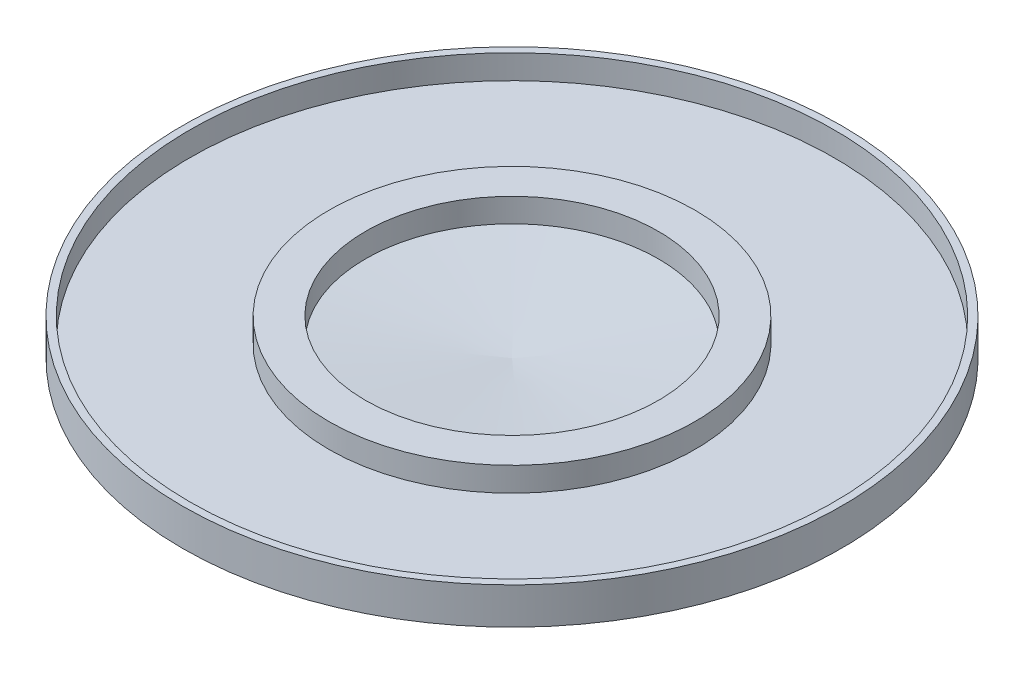
ISO-10303-21;
HEADER;
FILE_DESCRIPTION(('STEP AP214'),'2;1');
FILE_NAME('part.step','',(''),(''),'','','');
FILE_SCHEMA(('AUTOMOTIVE_DESIGN { 1 0 10303 214 1 1 1 1 }'));
ENDSEC;
DATA;
#1=APPLICATION_CONTEXT('core data for automotive mechanical design processes');
#2=APPLICATION_PROTOCOL_DEFINITION('international standard','automotive_design',2000,#1);
#3=PRODUCT_CONTEXT('',#1,'mechanical');
#4=PRODUCT('Part','Part','',(#3));
#5=PRODUCT_RELATED_PRODUCT_CATEGORY('part','',(#4));
#6=PRODUCT_DEFINITION_FORMATION('','',#4);
#7=PRODUCT_DEFINITION_CONTEXT('part definition',#1,'design');
#8=PRODUCT_DEFINITION('design','',#6,#7);
#9=PRODUCT_DEFINITION_SHAPE('','',#8);
#10=(LENGTH_UNIT() NAMED_UNIT(*) SI_UNIT(.MILLI.,.METRE.));
#11=(NAMED_UNIT(*) PLANE_ANGLE_UNIT() SI_UNIT($,.RADIAN.));
#12=(NAMED_UNIT(*) SI_UNIT($,.STERADIAN.) SOLID_ANGLE_UNIT());
#13=UNCERTAINTY_MEASURE_WITH_UNIT(LENGTH_MEASURE(1.E-05),#10,'distance_accuracy_value','');
#14=(GEOMETRIC_REPRESENTATION_CONTEXT(3) GLOBAL_UNCERTAINTY_ASSIGNED_CONTEXT((#13)) GLOBAL_UNIT_ASSIGNED_CONTEXT((#10,
#11,#12)) REPRESENTATION_CONTEXT('',''));
#15=CARTESIAN_POINT('',(0.,0.,0.));
#16=DIRECTION('',(0.,0.,1.));
#17=DIRECTION('',(1.,0.,0.));
#18=AXIS2_PLACEMENT_3D('',#15,#16,#17);
#19=CARTESIAN_POINT('',(0.,50.,0.));
#20=DIRECTION('',(0.,-1.,0.));
#21=DIRECTION('',(0.,0.,-1.));
#22=AXIS2_PLACEMENT_3D('',#19,#20,#21);
#23=CYLINDRICAL_SURFACE('',#22,200.02);
#24=CARTESIAN_POINT('',(0.,50.,0.));
#25=DIRECTION('',(0.,1.,0.));
#26=DIRECTION('',(0.,0.,1.));
#27=AXIS2_PLACEMENT_3D('',#24,#25,#26);
#28=CIRCLE('',#27,200.02);
#29=CARTESIAN_POINT('',(0.,50.,200.02));
#30=VERTEX_POINT('',#29);
#31=EDGE_CURVE('E58',#30,#30,#28,.T.);
#32=ORIENTED_EDGE('',*,*,#31,.T.);
#33=EDGE_LOOP('',(#32));
#34=FACE_BOUND('',#33,.T.);
#35=CARTESIAN_POINT('',(0.,0.,0.));
#36=DIRECTION('',(0.,1.,0.));
#37=DIRECTION('',(0.,0.,1.));
#38=AXIS2_PLACEMENT_3D('',#35,#36,#37);
#39=CIRCLE('',#38,200.02);
#40=CARTESIAN_POINT('',(0.,0.,200.02));
#41=VERTEX_POINT('',#40);
#42=EDGE_CURVE('E54',#41,#41,#39,.T.);
#43=ORIENTED_EDGE('',*,*,#42,.F.);
#44=EDGE_LOOP('',(#43));
#45=FACE_BOUND('',#44,.T.);
#46=ADVANCED_FACE('F51',(#34,#45),#23,.F.);
#47=CARTESIAN_POINT('',(0.,50.,0.));
#48=DIRECTION('',(0.,-1.,0.));
#49=DIRECTION('',(0.,0.,-1.));
#50=AXIS2_PLACEMENT_3D('',#47,#48,#49);
#51=CYLINDRICAL_SURFACE('',#50,250.);
#52=CARTESIAN_POINT('',(0.,17.,0.));
#53=DIRECTION('',(0.,1.,0.));
#54=DIRECTION('',(0.,0.,1.));
#55=AXIS2_PLACEMENT_3D('',#52,#53,#54);
#56=CIRCLE('',#55,250.);
#57=CARTESIAN_POINT('',(0.,17.,250.));
#58=VERTEX_POINT('',#57);
#59=EDGE_CURVE('E64',#58,#58,#56,.T.);
#60=ORIENTED_EDGE('',*,*,#59,.T.);
#61=EDGE_LOOP('',(#60));
#62=FACE_BOUND('',#61,.T.);
#63=CARTESIAN_POINT('',(0.,50.,0.));
#64=DIRECTION('',(0.,1.,0.));
#65=DIRECTION('',(0.,0.,1.));
#66=AXIS2_PLACEMENT_3D('',#63,#64,#65);
#67=CIRCLE('',#66,250.);
#68=CARTESIAN_POINT('',(0.,50.,250.));
#69=VERTEX_POINT('',#68);
#70=EDGE_CURVE('E12',#69,#69,#67,.T.);
#71=ORIENTED_EDGE('',*,*,#70,.F.);
#72=EDGE_LOOP('',(#71));
#73=FACE_BOUND('',#72,.T.);
#74=ADVANCED_FACE('F106',(#62,#73),#51,.T.);
#75=CARTESIAN_POINT('',(0.,50.,0.));
#76=DIRECTION('',(0.,1.,0.));
#77=DIRECTION('',(0.,0.,1.));
#78=AXIS2_PLACEMENT_3D('',#75,#76,#77);
#79=PLANE('',#78);
#80=ORIENTED_EDGE('',*,*,#31,.F.);
#81=EDGE_LOOP('',(#80));
#82=FACE_BOUND('',#81,.T.);
#83=ORIENTED_EDGE('',*,*,#70,.T.);
#84=EDGE_LOOP('',(#83));
#85=FACE_BOUND('',#84,.T.);
#86=ADVANCED_FACE('F97',(#82,#85),#79,.T.);
#87=CARTESIAN_POINT('',(0.,0.,0.));
#88=DIRECTION('',(0.,1.,0.));
#89=DIRECTION('',(0.,0.,1.));
#90=AXIS2_PLACEMENT_3D('',#87,#88,#89);
#91=PLANE('',#90);
#92=ORIENTED_EDGE('',*,*,#42,.T.);
#93=EDGE_LOOP('',(#92));
#94=FACE_BOUND('',#93,.T.);
#95=CARTESIAN_POINT('',(0.,0.,0.));
#96=DIRECTION('',(0.,1.,0.));
#97=DIRECTION('',(0.,0.,1.));
#98=AXIS2_PLACEMENT_3D('',#95,#96,#97);
#99=CIRCLE('',#98,450.);
#100=CARTESIAN_POINT('',(0.,0.,450.));
#101=VERTEX_POINT('',#100);
#102=EDGE_CURVE('E71',#101,#101,#99,.T.);
#103=ORIENTED_EDGE('',*,*,#102,.F.);
#104=EDGE_LOOP('',(#103));
#105=FACE_BOUND('',#104,.T.);
#106=ADVANCED_FACE('F94',(#94,#105),#91,.F.);
#107=CARTESIAN_POINT('',(0.,17.,0.));
#108=DIRECTION('',(0.,1.,0.));
#109=DIRECTION('',(0.,0.,1.));
#110=AXIS2_PLACEMENT_3D('',#107,#108,#109);
#111=PLANE('',#110);
#112=ORIENTED_EDGE('',*,*,#59,.F.);
#113=EDGE_LOOP('',(#112));
#114=FACE_BOUND('',#113,.T.);
#115=CARTESIAN_POINT('',(0.,17.,0.));
#116=DIRECTION('',(0.,1.,0.));
#117=DIRECTION('',(0.,0.,1.));
#118=AXIS2_PLACEMENT_3D('',#115,#116,#117);
#119=CIRCLE('',#118,440.);
#120=CARTESIAN_POINT('',(0.,17.,440.));
#121=VERTEX_POINT('',#120);
#122=EDGE_CURVE('E67',#121,#121,#119,.F.);
#123=ORIENTED_EDGE('',*,*,#122,.F.);
#124=EDGE_LOOP('',(#123));
#125=FACE_BOUND('',#124,.T.);
#126=ADVANCED_FACE('F96',(#114,#125),#111,.T.);
#127=CARTESIAN_POINT('',(0.,50.,0.));
#128=DIRECTION('',(0.,-1.,0.));
#129=DIRECTION('',(0.,0.,-1.));
#130=AXIS2_PLACEMENT_3D('',#127,#128,#129);
#131=CYLINDRICAL_SURFACE('',#130,440.);
#132=ORIENTED_EDGE('',*,*,#122,.T.);
#133=EDGE_LOOP('',(#132));
#134=FACE_BOUND('',#133,.T.);
#135=CARTESIAN_POINT('',(0.,50.,0.));
#136=DIRECTION('',(0.,1.,0.));
#137=DIRECTION('',(0.,0.,1.));
#138=AXIS2_PLACEMENT_3D('',#135,#136,#137);
#139=CIRCLE('',#138,440.);
#140=CARTESIAN_POINT('',(0.,50.,440.));
#141=VERTEX_POINT('',#140);
#142=EDGE_CURVE('E74',#141,#141,#139,.T.);
#143=ORIENTED_EDGE('',*,*,#142,.T.);
#144=EDGE_LOOP('',(#143));
#145=FACE_BOUND('',#144,.T.);
#146=ADVANCED_FACE('F80',(#134,#145),#131,.F.);
#147=CARTESIAN_POINT('',(0.,50.,0.));
#148=DIRECTION('',(0.,-1.,0.));
#149=DIRECTION('',(0.,0.,-1.));
#150=AXIS2_PLACEMENT_3D('',#147,#148,#149);
#151=CYLINDRICAL_SURFACE('',#150,450.);
#152=CARTESIAN_POINT('',(0.,50.,0.));
#153=DIRECTION('',(0.,1.,0.));
#154=DIRECTION('',(0.,0.,1.));
#155=AXIS2_PLACEMENT_3D('',#152,#153,#154);
#156=CIRCLE('',#155,450.);
#157=CARTESIAN_POINT('',(0.,50.,450.));
#158=VERTEX_POINT('',#157);
#159=EDGE_CURVE('E70',#158,#158,#156,.T.);
#160=ORIENTED_EDGE('',*,*,#159,.F.);
#161=EDGE_LOOP('',(#160));
#162=FACE_BOUND('',#161,.T.);
#163=ORIENTED_EDGE('',*,*,#102,.T.);
#164=EDGE_LOOP('',(#163));
#165=FACE_BOUND('',#164,.T.);
#166=ADVANCED_FACE('F85',(#162,#165),#151,.T.);
#167=CARTESIAN_POINT('',(0.,50.,0.));
#168=DIRECTION('',(0.,1.,0.));
#169=DIRECTION('',(0.,0.,1.));
#170=AXIS2_PLACEMENT_3D('',#167,#168,#169);
#171=PLANE('',#170);
#172=ORIENTED_EDGE('',*,*,#142,.F.);
#173=EDGE_LOOP('',(#172));
#174=FACE_BOUND('',#173,.T.);
#175=ORIENTED_EDGE('',*,*,#159,.T.);
#176=EDGE_LOOP('',(#175));
#177=FACE_BOUND('',#176,.T.);
#178=ADVANCED_FACE('F82',(#174,#177),#171,.T.);
#179=CLOSED_SHELL('',(#46,#74,#86,#106,#126,#146,#166,#178));
#180=MANIFOLD_SOLID_BREP('B2',#179);
#181=CARTESIAN_POINT('',(0.,0.,0.));
#182=DIRECTION('',(0.,-1.,0.));
#183=DIRECTION('',(0.,0.,-1.));
#184=AXIS2_PLACEMENT_3D('',#181,#182,#183);
#185=PLANE('',#184);
#186=CARTESIAN_POINT('',(-0.01,0.,0.));
#187=DIRECTION('',(0.,-1.,0.));
#188=DIRECTION('',(0.,0.,-1.));
#189=AXIS2_PLACEMENT_3D('',#186,#187,#188);
#190=CIRCLE('',#189,200.01);
#191=CARTESIAN_POINT('',(-0.01,0.,-200.01));
#192=VERTEX_POINT('',#191);
#193=EDGE_CURVE('E50',#192,#192,#190,.T.);
#194=ORIENTED_EDGE('',*,*,#193,.T.);
#195=EDGE_LOOP('',(#194));
#196=FACE_BOUND('',#195,.T.);
#197=CARTESIAN_POINT('',(-0.01,0.,0.));
#198=DIRECTION('',(0.,-1.,0.));
#199=DIRECTION('',(0.,0.,-1.));
#200=AXIS2_PLACEMENT_3D('',#197,#198,#199);
#201=CIRCLE('',#200,0.01);
#202=CARTESIAN_POINT('',(-0.01,0.,0.01000000000001));
#203=VERTEX_POINT('',#202);
#204=EDGE_CURVE('E189',#203,#203,#201,.T.);
#205=ORIENTED_EDGE('',*,*,#204,.F.);
#206=EDGE_LOOP('',(#205));
#207=FACE_BOUND('',#206,.T.);
#208=ADVANCED_FACE('F179',(#196,#207),#185,.T.);
#209=CARTESIAN_POINT('',(-0.01,0.,0.));
#210=DIRECTION('',(0.,-1.,0.));
#211=DIRECTION('',(0.,0.,-1.));
#212=AXIS2_PLACEMENT_3D('',#209,#210,#211);
#213=CYLINDRICAL_SURFACE('',#212,200.01);
#214=CARTESIAN_POINT('',(-0.01,17.499231759728,0.));
#215=DIRECTION('',(0.,-1.,0.));
#216=DIRECTION('',(0.,0.,-1.));
#217=AXIS2_PLACEMENT_3D('',#214,#215,#216);
#218=CIRCLE('',#217,200.01);
#219=CARTESIAN_POINT('',(-0.01,17.499231759728,200.01));
#220=VERTEX_POINT('',#219);
#221=EDGE_CURVE('E185',#220,#220,#218,.T.);
#222=ORIENTED_EDGE('',*,*,#221,.T.);
#223=EDGE_LOOP('',(#222));
#224=FACE_BOUND('',#223,.T.);
#225=ORIENTED_EDGE('',*,*,#193,.F.);
#226=EDGE_LOOP('',(#225));
#227=FACE_BOUND('',#226,.T.);
#228=ADVANCED_FACE('F200',(#224,#227),#213,.T.);
#229=CARTESIAN_POINT('',(-0.01,17.499231759728,0.));
#230=DIRECTION('',(0.,1.,0.));
#231=DIRECTION('',(0.,0.,1.));
#232=AXIS2_PLACEMENT_3D('',#229,#230,#231);
#233=CONICAL_SURFACE('',#232,200.01,1.48352242586232);
#234=CARTESIAN_POINT('',(-0.01,0.,0.01000000000001));
#235=CARTESIAN_POINT('',(-0.01,0.182283664163832,2.09333333333335));
#236=CARTESIAN_POINT('',(-0.01,0.364567328327666,4.17666666666668));
#237=CARTESIAN_POINT('',(-0.01,0.729134656655335,8.34333333333335));
#238=CARTESIAN_POINT('',(-0.01,0.91141832081917,10.4266666666667));
#239=CARTESIAN_POINT('',(-0.01,1.27598564914684,14.5933333333334));
#240=CARTESIAN_POINT('',(-0.01,1.45826931331067,16.6766666666667));
#241=CARTESIAN_POINT('',(-0.01,1.82283664163834,20.8433333333334));
#242=CARTESIAN_POINT('',(-0.01,2.00512030580217,22.9266666666667));
#243=CARTESIAN_POINT('',(-0.01,2.36968763412984,27.0933333333334));
#244=CARTESIAN_POINT('',(-0.01,2.55197129829367,29.1766666666667));
#245=CARTESIAN_POINT('',(-0.01,2.91653862662134,33.3433333333334));
#246=CARTESIAN_POINT('',(-0.01,3.09882229078517,35.4266666666667));
#247=CARTESIAN_POINT('',(-0.01,3.46338961911284,39.5933333333333));
#248=CARTESIAN_POINT('',(-0.01,3.64567328327668,41.6766666666667));
#249=CARTESIAN_POINT('',(-0.01,4.01024061160434,45.8433333333334));
#250=CARTESIAN_POINT('',(-0.01,4.19252427576818,47.9266666666667));
#251=CARTESIAN_POINT('',(-0.01,4.55709160409585,52.0933333333334));
#252=CARTESIAN_POINT('',(-0.01,4.73937526825968,54.1766666666667));
#253=CARTESIAN_POINT('',(-0.01,5.10394259658735,58.3433333333334));
#254=CARTESIAN_POINT('',(-0.01,5.28622626075118,60.4266666666667));
#255=CARTESIAN_POINT('',(-0.01,5.65079358907885,64.5933333333334));
#256=CARTESIAN_POINT('',(-0.01,5.83307725324268,66.6766666666667));
#257=CARTESIAN_POINT('',(-0.01,6.19764458157035,70.8433333333334));
#258=CARTESIAN_POINT('',(-0.01,6.37992824573418,72.9266666666667));
#259=CARTESIAN_POINT('',(-0.01,6.74449557406185,77.0933333333334));
#260=CARTESIAN_POINT('',(-0.01,6.92677923822569,79.1766666666667));
#261=CARTESIAN_POINT('',(-0.01,7.29134656655335,83.3433333333333));
#262=CARTESIAN_POINT('',(-0.01,7.47363023071719,85.4266666666667));
#263=CARTESIAN_POINT('',(-0.01,7.83819755904485,89.5933333333333));
#264=CARTESIAN_POINT('',(-0.01,8.02048122320869,91.6766666666667));
#265=CARTESIAN_POINT('',(-0.01,8.38504855153636,95.8433333333333));
#266=CARTESIAN_POINT('',(-0.01,8.56733221570019,97.9266666666667));
#267=CARTESIAN_POINT('',(-0.01,8.93189954402786,102.093333333333));
#268=CARTESIAN_POINT('',(-0.01,9.11418320819169,104.176666666667));
#269=CARTESIAN_POINT('',(-0.01,9.47875053651936,108.343333333333));
#270=CARTESIAN_POINT('',(-0.01,9.6610342006832,110.426666666667));
#271=CARTESIAN_POINT('',(-0.01,10.0256015290109,114.593333333333));
#272=CARTESIAN_POINT('',(-0.01,10.2078851931747,116.676666666667));
#273=CARTESIAN_POINT('',(-0.01,10.5724525215024,120.843333333333));
#274=CARTESIAN_POINT('',(-0.01,10.7547361856662,122.926666666667));
#275=CARTESIAN_POINT('',(-0.01,11.1193035139939,127.093333333333));
#276=CARTESIAN_POINT('',(-0.01,11.3015871781577,129.176666666667));
#277=CARTESIAN_POINT('',(-0.01,11.6661545064854,133.343333333333));
#278=CARTESIAN_POINT('',(-0.01,11.8484381706492,135.426666666667));
#279=CARTESIAN_POINT('',(-0.01,12.2130054989769,139.593333333333));
#280=CARTESIAN_POINT('',(-0.01,12.3952891631407,141.676666666667));
#281=CARTESIAN_POINT('',(-0.01,12.7598564914684,145.843333333333));
#282=CARTESIAN_POINT('',(-0.01,12.9421401556322,147.926666666667));
#283=CARTESIAN_POINT('',(-0.01,13.3067074839599,152.093333333333));
#284=CARTESIAN_POINT('',(-0.01,13.4889911481237,154.176666666667));
#285=CARTESIAN_POINT('',(-0.01,13.8535584764514,158.343333333333));
#286=CARTESIAN_POINT('',(-0.01,14.0358421406152,160.426666666667));
#287=CARTESIAN_POINT('',(-0.01,14.4004094689429,164.593333333333));
#288=CARTESIAN_POINT('',(-0.01,14.5826931331067,166.676666666667));
#289=CARTESIAN_POINT('',(-0.01,14.9472604614344,170.843333333333));
#290=CARTESIAN_POINT('',(-0.01,15.1295441255982,172.926666666667));
#291=CARTESIAN_POINT('',(-0.01,15.4941114539259,177.093333333333));
#292=CARTESIAN_POINT('',(-0.01,15.6763951180897,179.176666666667));
#293=CARTESIAN_POINT('',(-0.01,16.0409624464174,183.343333333333));
#294=CARTESIAN_POINT('',(-0.01,16.2232461105812,185.426666666667));
#295=CARTESIAN_POINT('',(-0.01,16.5878134389089,189.593333333333));
#296=CARTESIAN_POINT('',(-0.01,16.7700971030727,191.676666666667));
#297=CARTESIAN_POINT('',(-0.01,17.1346644314004,195.843333333333));
#298=CARTESIAN_POINT('',(-0.01,17.3169480955642,197.926666666667));
#299=CARTESIAN_POINT('',(-0.01,17.499231759728,200.01));
#300=B_SPLINE_CURVE_WITH_KNOTS('',3,(#234,#235,#236,#237,#238,#239,#240,#241,#242,#243,#244,
#245,#246,#247,#248,#249,#250,#251,#252,#253,#254,#255,#256,#257,#258,#259,#260,#261,#262,#263,
#264,#265,#266,#267,#268,#269,#270,#271,#272,#273,#274,#275,#276,#277,#278,#279,#280,#281,#282,
#283,#284,#285,#286,#287,#288,#289,#290,#291,#292,#293,#294,#295,#296,#297,#298,#299),
.UNSPECIFIED.,.F.,.F.,(4,2,2,2,2,2,2,2,2,2,2,2,2,2,2,2,2,2,2,2,2,2,2,2,2,2,2,2,2,2,2,2,4),(0.,
6.27387806766987,12.5477561353397,18.8216342030096,25.0955122706795,31.3693903383493,
37.6432684060192,43.9171464736891,50.1910245413589,56.4649026090288,62.7387806766987,
69.0126587443685,75.2865368120383,81.5604148797082,87.8342929473781,94.1081710150479,
100.382049082718,106.655927150388,112.929805218058,119.203683285727,125.477561353397,
131.751439421067,138.025317488737,144.299195556407,150.573073624077,156.846951691747,
163.120829759417,169.394707827086,175.668585894756,181.942463962426,188.216342030096,
194.490220097766,200.764098165436),.UNSPECIFIED.);
#301=EDGE_CURVE('BSEAM196',#203,#220,#300,.T.);
#302=ORIENTED_EDGE('',*,*,#204,.T.);
#303=ORIENTED_EDGE('',*,*,#221,.F.);
#304=ORIENTED_EDGE('',*,*,#301,.T.);
#305=ORIENTED_EDGE('',*,*,#301,.F.);
#306=EDGE_LOOP('',(#302,#304,#303,#305));
#307=FACE_BOUND('',#306,.T.);
#308=ADVANCED_FACE('F196',(#307),#233,.F.);
#309=CLOSED_SHELL('',(#208,#228,#308));
#310=MANIFOLD_SOLID_BREP('B7',#309);
#311=ADVANCED_BREP_SHAPE_REPRESENTATION('',(#18,#180,#310),#14);
#312=SHAPE_DEFINITION_REPRESENTATION(#9,#311);
ENDSEC;
END-ISO-10303-21;
